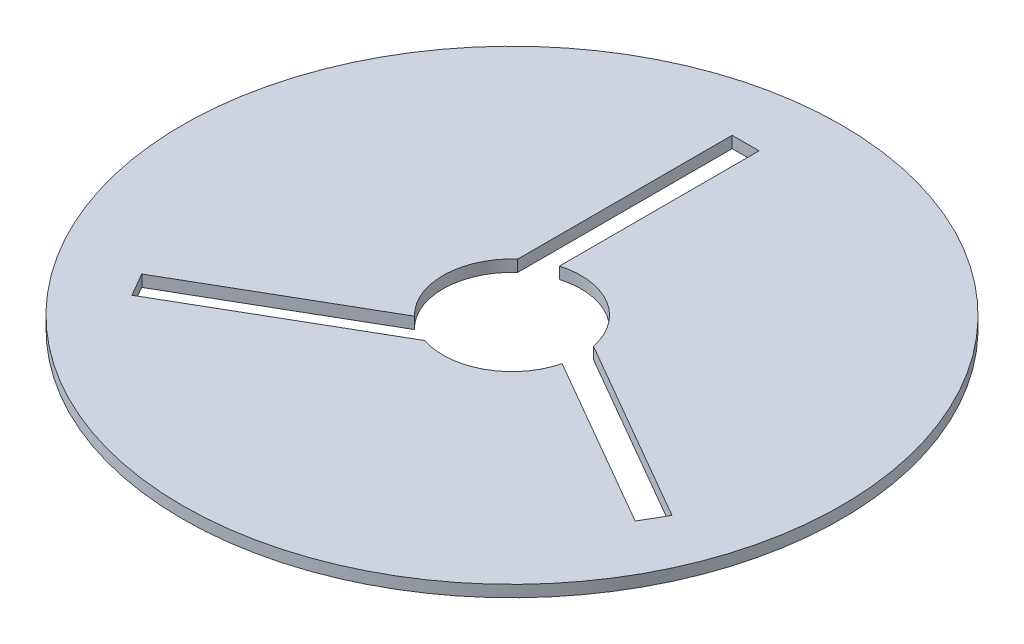
ISO-10303-21;
HEADER;
FILE_DESCRIPTION(('STEP AP214'),'2;1');
FILE_NAME('part.step','',(''),(''),'','','');
FILE_SCHEMA(('AUTOMOTIVE_DESIGN { 1 0 10303 214 1 1 1 1 }'));
ENDSEC;
DATA;
#1=APPLICATION_CONTEXT('core data for automotive mechanical design processes');
#2=APPLICATION_PROTOCOL_DEFINITION('international standard','automotive_design',2000,#1);
#3=PRODUCT_CONTEXT('',#1,'mechanical');
#4=PRODUCT('Part','Part','',(#3));
#5=PRODUCT_RELATED_PRODUCT_CATEGORY('part','',(#4));
#6=PRODUCT_DEFINITION_FORMATION('','',#4);
#7=PRODUCT_DEFINITION_CONTEXT('part definition',#1,'design');
#8=PRODUCT_DEFINITION('design','',#6,#7);
#9=PRODUCT_DEFINITION_SHAPE('','',#8);
#10=(LENGTH_UNIT() NAMED_UNIT(*) SI_UNIT(.MILLI.,.METRE.));
#11=(NAMED_UNIT(*) PLANE_ANGLE_UNIT() SI_UNIT($,.RADIAN.));
#12=(NAMED_UNIT(*) SI_UNIT($,.STERADIAN.) SOLID_ANGLE_UNIT());
#13=UNCERTAINTY_MEASURE_WITH_UNIT(LENGTH_MEASURE(1.E-05),#10,'distance_accuracy_value','');
#14=(GEOMETRIC_REPRESENTATION_CONTEXT(3) GLOBAL_UNCERTAINTY_ASSIGNED_CONTEXT((#13)) GLOBAL_UNIT_ASSIGNED_CONTEXT((#10,
#11,#12)) REPRESENTATION_CONTEXT('',''));
#15=CARTESIAN_POINT('',(0.,0.,0.));
#16=DIRECTION('',(0.,0.,1.));
#17=DIRECTION('',(1.,0.,0.));
#18=AXIS2_PLACEMENT_3D('',#15,#16,#17);
#19=CARTESIAN_POINT('',(0.,3.,0.));
#20=DIRECTION('',(0.,-1.,0.));
#21=DIRECTION('',(0.,0.,-1.));
#22=AXIS2_PLACEMENT_3D('',#19,#20,#21);
#23=CYLINDRICAL_SURFACE('',#22,17.8);
#24=CARTESIAN_POINT('',(0.,0.,0.));
#25=DIRECTION('',(0.,1.,0.));
#26=DIRECTION('',(0.,0.,1.));
#27=AXIS2_PLACEMENT_3D('',#24,#25,#26);
#28=CIRCLE('',#27,17.8);
#29=CARTESIAN_POINT('',(-5.61081880339964,0.,16.8925638183023));
#30=VERTEX_POINT('',#29);
#31=CARTESIAN_POINT('',(17.2630899328785,0.,4.33886228974228));
#32=VERTEX_POINT('',#31);
#33=EDGE_CURVE('E164',#30,#32,#28,.T.);
#34=ORIENTED_EDGE('',*,*,#33,.F.);
#35=DIRECTION('',(0.,-1.,0.));
#36=VECTOR('',#35,1.);
#37=CARTESIAN_POINT('',(-5.61081880339964,3.,16.8925638183023));
#38=LINE('',#37,#36);
#39=CARTESIAN_POINT('',(-5.61081880339964,3.,16.8925638183023));
#40=VERTEX_POINT('',#39);
#41=EDGE_CURVE('E11',#40,#30,#38,.T.);
#42=ORIENTED_EDGE('',*,*,#41,.F.);
#43=CARTESIAN_POINT('',(0.,3.,0.));
#44=DIRECTION('',(0.,1.,0.));
#45=DIRECTION('',(0.,0.,1.));
#46=AXIS2_PLACEMENT_3D('',#43,#44,#45);
#47=CIRCLE('',#46,17.8);
#48=CARTESIAN_POINT('',(17.2630899328785,3.,4.33886228974228));
#49=VERTEX_POINT('',#48);
#50=EDGE_CURVE('E199',#40,#49,#47,.T.);
#51=ORIENTED_EDGE('',*,*,#50,.T.);
#52=DIRECTION('',(0.,-1.,0.));
#53=VECTOR('',#52,1.);
#54=CARTESIAN_POINT('',(17.2630899328785,3.,4.33886228974228));
#55=LINE('',#54,#53);
#56=EDGE_CURVE('E59',#49,#32,#55,.T.);
#57=ORIENTED_EDGE('',*,*,#56,.T.);
#58=EDGE_LOOP('',(#34,#42,#51,#57));
#59=FACE_BOUND('',#58,.T.);
#60=ADVANCED_FACE('F43',(#59),#23,.F.);
#61=CARTESIAN_POINT('',(5.91198999999993,3.,10.239867053839));
#62=DIRECTION('',(-0.5,0.,-0.866025403784438));
#63=DIRECTION('',(-0.866025403784439,0.,0.5));
#64=AXIS2_PLACEMENT_3D('',#61,#62,#63);
#65=PLANE('',#64);
#66=DIRECTION('',(0.866025403784439,0.,-0.5));
#67=VECTOR('',#66,1.);
#68=CARTESIAN_POINT('',(5.91198999999993,0.,10.239867053839));
#69=LINE('',#68,#67);
#70=CARTESIAN_POINT('',(-53.4973526996125,0.,44.539867053839));
#71=VERTEX_POINT('',#70);
#72=EDGE_CURVE('E166',#71,#30,#69,.T.);
#73=ORIENTED_EDGE('',*,*,#72,.F.);
#74=DIRECTION('',(0.,-1.,0.));
#75=VECTOR('',#74,1.);
#76=CARTESIAN_POINT('',(-53.4973526996125,3.,44.539867053839));
#77=LINE('',#76,#75);
#78=CARTESIAN_POINT('',(-53.4973526996125,3.,44.539867053839));
#79=VERTEX_POINT('',#78);
#80=EDGE_CURVE('E51',#79,#71,#77,.T.);
#81=ORIENTED_EDGE('',*,*,#80,.F.);
#82=DIRECTION('',(0.866025403784439,0.,-0.5));
#83=VECTOR('',#82,1.);
#84=CARTESIAN_POINT('',(5.91198999999993,3.,10.239867053839));
#85=LINE('',#84,#83);
#86=EDGE_CURVE('E237',#79,#40,#85,.T.);
#87=ORIENTED_EDGE('',*,*,#86,.T.);
#88=ORIENTED_EDGE('',*,*,#41,.T.);
#89=EDGE_LOOP('',(#73,#81,#87,#88));
#90=FACE_BOUND('',#89,.T.);
#91=ADVANCED_FACE('F224',(#90),#65,.T.);
#92=CARTESIAN_POINT('',(-59.4093426996125,3.,34.3));
#93=DIRECTION('',(0.866025403784439,0.,-0.5));
#94=DIRECTION('',(-0.5,0.,-0.866025403784439));
#95=AXIS2_PLACEMENT_3D('',#92,#93,#94);
#96=PLANE('',#95);
#97=DIRECTION('',(0.5,0.,0.866025403784439));
#98=VECTOR('',#97,1.);
#99=CARTESIAN_POINT('',(-59.4093426996125,0.,34.3));
#100=LINE('',#99,#98);
#101=CARTESIAN_POINT('',(-56.9723526996125,0.,38.5209904975371));
#102=VERTEX_POINT('',#101);
#103=EDGE_CURVE('E169',#102,#71,#100,.T.);
#104=ORIENTED_EDGE('',*,*,#103,.F.);
#105=DIRECTION('',(0.,-1.,0.));
#106=VECTOR('',#105,1.);
#107=CARTESIAN_POINT('',(-56.9723526996125,3.,38.5209904975371));
#108=LINE('',#107,#106);
#109=CARTESIAN_POINT('',(-56.9723526996125,3.,38.5209904975371));
#110=VERTEX_POINT('',#109);
#111=EDGE_CURVE('E213',#110,#102,#108,.T.);
#112=ORIENTED_EDGE('',*,*,#111,.F.);
#113=DIRECTION('',(0.5,0.,0.866025403784439));
#114=VECTOR('',#113,1.);
#115=CARTESIAN_POINT('',(-59.4093426996125,3.,34.3));
#116=LINE('',#115,#114);
#117=EDGE_CURVE('E220',#110,#79,#116,.T.);
#118=ORIENTED_EDGE('',*,*,#117,.T.);
#119=ORIENTED_EDGE('',*,*,#80,.T.);
#120=EDGE_LOOP('',(#104,#112,#118,#119));
#121=FACE_BOUND('',#120,.T.);
#122=ADVANCED_FACE('F218',(#121),#96,.T.);
#123=CARTESIAN_POINT('',(2.43698999999993,3.,4.22099049753716));
#124=DIRECTION('',(0.5,0.,0.866025403784439));
#125=DIRECTION('',(0.866025403784439,0.,-0.5));
#126=AXIS2_PLACEMENT_3D('',#123,#124,#125);
#127=PLANE('',#126);
#128=DIRECTION('',(-0.866025403784439,0.,0.5));
#129=VECTOR('',#128,1.);
#130=CARTESIAN_POINT('',(2.43698999999993,0.,4.22099049753716));
#131=LINE('',#130,#129);
#132=CARTESIAN_POINT('',(-12.3891099328786,0.,12.7808432848169));
#133=VERTEX_POINT('',#132);
#134=EDGE_CURVE('E172',#133,#102,#131,.T.);
#135=ORIENTED_EDGE('',*,*,#134,.F.);
#136=DIRECTION('',(0.,-1.,0.));
#137=VECTOR('',#136,1.);
#138=CARTESIAN_POINT('',(-12.3891099328786,3.,12.7808432848169));
#139=LINE('',#138,#137);
#140=CARTESIAN_POINT('',(-12.3891099328786,3.,12.7808432848169));
#141=VERTEX_POINT('',#140);
#142=EDGE_CURVE('E211',#141,#133,#139,.T.);
#143=ORIENTED_EDGE('',*,*,#142,.F.);
#144=DIRECTION('',(-0.866025403784439,0.,0.5));
#145=VECTOR('',#144,1.);
#146=CARTESIAN_POINT('',(2.43698999999993,3.,4.22099049753716));
#147=LINE('',#146,#145);
#148=EDGE_CURVE('E234',#141,#110,#147,.T.);
#149=ORIENTED_EDGE('',*,*,#148,.T.);
#150=ORIENTED_EDGE('',*,*,#111,.T.);
#151=EDGE_LOOP('',(#135,#143,#149,#150));
#152=FACE_BOUND('',#151,.T.);
#153=ADVANCED_FACE('F231',(#152),#127,.T.);
#154=CARTESIAN_POINT('',(0.,3.,0.));
#155=DIRECTION('',(0.,-1.,0.));
#156=DIRECTION('',(0.,0.,-1.));
#157=AXIS2_PLACEMENT_3D('',#154,#155,#156);
#158=CYLINDRICAL_SURFACE('',#157,17.8);
#159=CARTESIAN_POINT('',(0.,0.,0.));
#160=DIRECTION('',(0.,1.,0.));
#161=DIRECTION('',(0.,0.,1.));
#162=AXIS2_PLACEMENT_3D('',#159,#160,#161);
#163=CIRCLE('',#162,17.8);
#164=CARTESIAN_POINT('',(-11.82398,0.,-13.3053935289265));
#165=VERTEX_POINT('',#164);
#166=EDGE_CURVE('E175',#165,#133,#163,.T.);
#167=ORIENTED_EDGE('',*,*,#166,.F.);
#168=DIRECTION('',(0.,-1.,0.));
#169=VECTOR('',#168,1.);
#170=CARTESIAN_POINT('',(-11.82398,3.,-13.3053935289265));
#171=LINE('',#170,#169);
#172=CARTESIAN_POINT('',(-11.82398,3.,-13.3053935289265));
#173=VERTEX_POINT('',#172);
#174=EDGE_CURVE('E209',#173,#165,#171,.T.);
#175=ORIENTED_EDGE('',*,*,#174,.F.);
#176=CARTESIAN_POINT('',(0.,3.,0.));
#177=DIRECTION('',(0.,1.,0.));
#178=DIRECTION('',(0.,0.,1.));
#179=AXIS2_PLACEMENT_3D('',#176,#177,#178);
#180=CIRCLE('',#179,17.8);
#181=EDGE_CURVE('E239',#173,#141,#180,.T.);
#182=ORIENTED_EDGE('',*,*,#181,.T.);
#183=ORIENTED_EDGE('',*,*,#142,.T.);
#184=EDGE_LOOP('',(#167,#175,#182,#183));
#185=FACE_BOUND('',#184,.T.);
#186=ADVANCED_FACE('F279',(#185),#158,.F.);
#187=CARTESIAN_POINT('',(-11.82398,3.,0.));
#188=DIRECTION('',(1.,0.,0.));
#189=DIRECTION('',(0.,0.,-1.));
#190=AXIS2_PLACEMENT_3D('',#187,#188,#189);
#191=PLANE('',#190);
#192=DIRECTION('',(0.,0.,1.));
#193=VECTOR('',#192,1.);
#194=CARTESIAN_POINT('',(-11.82398,0.,0.));
#195=LINE('',#194,#193);
#196=CARTESIAN_POINT('',(-11.82398,0.,-68.6000000000001));
#197=VERTEX_POINT('',#196);
#198=EDGE_CURVE('E178',#197,#165,#195,.T.);
#199=ORIENTED_EDGE('',*,*,#198,.F.);
#200=DIRECTION('',(0.,-1.,0.));
#201=VECTOR('',#200,1.);
#202=CARTESIAN_POINT('',(-11.82398,3.,-68.6000000000001));
#203=LINE('',#202,#201);
#204=CARTESIAN_POINT('',(-11.82398,3.,-68.6000000000001));
#205=VERTEX_POINT('',#204);
#206=EDGE_CURVE('E207',#205,#197,#203,.T.);
#207=ORIENTED_EDGE('',*,*,#206,.F.);
#208=DIRECTION('',(0.,0.,1.));
#209=VECTOR('',#208,1.);
#210=CARTESIAN_POINT('',(-11.82398,3.,0.));
#211=LINE('',#210,#209);
#212=EDGE_CURVE('E245',#205,#173,#211,.T.);
#213=ORIENTED_EDGE('',*,*,#212,.T.);
#214=ORIENTED_EDGE('',*,*,#174,.T.);
#215=EDGE_LOOP('',(#199,#207,#213,#214));
#216=FACE_BOUND('',#215,.T.);
#217=ADVANCED_FACE('F282',(#216),#191,.T.);
#218=CARTESIAN_POINT('',(0.,3.,-68.6000000000001));
#219=DIRECTION('',(0.,0.,1.));
#220=DIRECTION('',(1.,0.,0.));
#221=AXIS2_PLACEMENT_3D('',#218,#219,#220);
#222=PLANE('',#221);
#223=DIRECTION('',(-1.,0.,0.));
#224=VECTOR('',#223,1.);
#225=CARTESIAN_POINT('',(0.,0.,-68.6000000000001));
#226=LINE('',#225,#224);
#227=CARTESIAN_POINT('',(-4.87397999999999,0.,-68.6000000000001));
#228=VERTEX_POINT('',#227);
#229=EDGE_CURVE('E181',#228,#197,#226,.T.);
#230=ORIENTED_EDGE('',*,*,#229,.F.);
#231=DIRECTION('',(0.,-1.,0.));
#232=VECTOR('',#231,1.);
#233=CARTESIAN_POINT('',(-4.87397999999999,3.,-68.6000000000001));
#234=LINE('',#233,#232);
#235=CARTESIAN_POINT('',(-4.87397999999999,3.,-68.6000000000001));
#236=VERTEX_POINT('',#235);
#237=EDGE_CURVE('E205',#236,#228,#234,.T.);
#238=ORIENTED_EDGE('',*,*,#237,.F.);
#239=DIRECTION('',(-1.,0.,0.));
#240=VECTOR('',#239,1.);
#241=CARTESIAN_POINT('',(0.,3.,-68.6000000000001));
#242=LINE('',#241,#240);
#243=EDGE_CURVE('E248',#236,#205,#242,.T.);
#244=ORIENTED_EDGE('',*,*,#243,.T.);
#245=ORIENTED_EDGE('',*,*,#206,.T.);
#246=EDGE_LOOP('',(#230,#238,#244,#245));
#247=FACE_BOUND('',#246,.T.);
#248=ADVANCED_FACE('F286',(#247),#222,.T.);
#249=CARTESIAN_POINT('',(-4.87397999999999,3.,0.));
#250=DIRECTION('',(-1.,0.,0.));
#251=DIRECTION('',(0.,0.,1.));
#252=AXIS2_PLACEMENT_3D('',#249,#250,#251);
#253=PLANE('',#252);
#254=DIRECTION('',(0.,0.,-1.));
#255=VECTOR('',#254,1.);
#256=CARTESIAN_POINT('',(-4.87397999999999,0.,0.));
#257=LINE('',#256,#255);
#258=CARTESIAN_POINT('',(-4.87397999999999,0.,-17.1197055745594));
#259=VERTEX_POINT('',#258);
#260=EDGE_CURVE('E184',#259,#228,#257,.T.);
#261=ORIENTED_EDGE('',*,*,#260,.F.);
#262=DIRECTION('',(0.,-1.,0.));
#263=VECTOR('',#262,1.);
#264=CARTESIAN_POINT('',(-4.87397999999999,3.,-17.1197055745594));
#265=LINE('',#264,#263);
#266=CARTESIAN_POINT('',(-4.87397999999999,3.,-17.1197055745594));
#267=VERTEX_POINT('',#266);
#268=EDGE_CURVE('E203',#267,#259,#265,.T.);
#269=ORIENTED_EDGE('',*,*,#268,.F.);
#270=DIRECTION('',(0.,0.,-1.));
#271=VECTOR('',#270,1.);
#272=CARTESIAN_POINT('',(-4.87397999999999,3.,0.));
#273=LINE('',#272,#271);
#274=EDGE_CURVE('E251',#267,#236,#273,.T.);
#275=ORIENTED_EDGE('',*,*,#274,.T.);
#276=ORIENTED_EDGE('',*,*,#237,.T.);
#277=EDGE_LOOP('',(#261,#269,#275,#276));
#278=FACE_BOUND('',#277,.T.);
#279=ADVANCED_FACE('F290',(#278),#253,.T.);
#280=CARTESIAN_POINT('',(0.,3.,0.));
#281=DIRECTION('',(0.,-1.,0.));
#282=DIRECTION('',(0.,0.,-1.));
#283=AXIS2_PLACEMENT_3D('',#280,#281,#282);
#284=CYLINDRICAL_SURFACE('',#283,17.8);
#285=CARTESIAN_POINT('',(0.,0.,0.));
#286=DIRECTION('',(0.,1.,0.));
#287=DIRECTION('',(0.,0.,1.));
#288=AXIS2_PLACEMENT_3D('',#285,#286,#287);
#289=CIRCLE('',#288,17.8);
#290=CARTESIAN_POINT('',(17.4347988033994,0.,-3.58717028937607));
#291=VERTEX_POINT('',#290);
#292=EDGE_CURVE('E187',#291,#259,#289,.T.);
#293=ORIENTED_EDGE('',*,*,#292,.F.);
#294=DIRECTION('',(0.,-1.,0.));
#295=VECTOR('',#294,1.);
#296=CARTESIAN_POINT('',(17.4347988033994,3.,-3.58717028937607));
#297=LINE('',#296,#295);
#298=CARTESIAN_POINT('',(17.4347988033994,3.,-3.58717028937607));
#299=VERTEX_POINT('',#298);
#300=EDGE_CURVE('E142',#299,#291,#297,.T.);
#301=ORIENTED_EDGE('',*,*,#300,.F.);
#302=CARTESIAN_POINT('',(0.,3.,0.));
#303=DIRECTION('',(0.,1.,0.));
#304=DIRECTION('',(0.,0.,1.));
#305=AXIS2_PLACEMENT_3D('',#302,#303,#304);
#306=CIRCLE('',#305,17.8);
#307=EDGE_CURVE('E153',#299,#267,#306,.T.);
#308=ORIENTED_EDGE('',*,*,#307,.T.);
#309=ORIENTED_EDGE('',*,*,#268,.T.);
#310=EDGE_LOOP('',(#293,#301,#308,#309));
#311=FACE_BOUND('',#310,.T.);
#312=ADVANCED_FACE('F255',(#311),#284,.F.);
#313=CARTESIAN_POINT('',(5.91199000000008,3.,-10.2398670538393));
#314=DIRECTION('',(-0.5,0.,0.866025403784439));
#315=DIRECTION('',(0.866025403784439,0.,0.5));
#316=AXIS2_PLACEMENT_3D('',#313,#314,#315);
#317=PLANE('',#316);
#318=DIRECTION('',(-0.866025403784439,0.,-0.5));
#319=VECTOR('',#318,1.);
#320=CARTESIAN_POINT('',(5.91199000000008,0.,-10.2398670538393));
#321=LINE('',#320,#319);
#322=CARTESIAN_POINT('',(65.3213326996125,0.,24.0601329461607));
#323=VERTEX_POINT('',#322);
#324=EDGE_CURVE('E138',#323,#291,#321,.T.);
#325=ORIENTED_EDGE('',*,*,#324,.F.);
#326=DIRECTION('',(0.,-1.,0.));
#327=VECTOR('',#326,1.);
#328=CARTESIAN_POINT('',(65.3213326996125,3.,24.0601329461607));
#329=LINE('',#328,#327);
#330=CARTESIAN_POINT('',(65.3213326996125,3.,24.0601329461607));
#331=VERTEX_POINT('',#330);
#332=EDGE_CURVE('E133',#331,#323,#329,.T.);
#333=ORIENTED_EDGE('',*,*,#332,.F.);
#334=DIRECTION('',(-0.866025403784439,0.,-0.5));
#335=VECTOR('',#334,1.);
#336=CARTESIAN_POINT('',(5.91199000000008,3.,-10.2398670538393));
#337=LINE('',#336,#335);
#338=EDGE_CURVE('E136',#331,#299,#337,.T.);
#339=ORIENTED_EDGE('',*,*,#338,.T.);
#340=ORIENTED_EDGE('',*,*,#300,.T.);
#341=EDGE_LOOP('',(#325,#333,#339,#340));
#342=FACE_BOUND('',#341,.T.);
#343=ADVANCED_FACE('F135',(#342),#317,.T.);
#344=CARTESIAN_POINT('',(59.4093426996124,3.,34.3));
#345=DIRECTION('',(-0.866025403784438,0.,-0.5));
#346=DIRECTION('',(-0.5,0.,0.866025403784439));
#347=AXIS2_PLACEMENT_3D('',#344,#345,#346);
#348=PLANE('',#347);
#349=DIRECTION('',(0.5,0.,-0.866025403784439));
#350=VECTOR('',#349,1.);
#351=CARTESIAN_POINT('',(59.4093426996124,0.,34.3));
#352=LINE('',#351,#350);
#353=CARTESIAN_POINT('',(61.8463326996125,0.,30.0790095024626));
#354=VERTEX_POINT('',#353);
#355=EDGE_CURVE('E191',#354,#323,#352,.T.);
#356=ORIENTED_EDGE('',*,*,#355,.F.);
#357=DIRECTION('',(0.,-1.,0.));
#358=VECTOR('',#357,1.);
#359=CARTESIAN_POINT('',(61.8463326996125,3.,30.0790095024626));
#360=LINE('',#359,#358);
#361=CARTESIAN_POINT('',(61.8463326996125,3.,30.0790095024626));
#362=VERTEX_POINT('',#361);
#363=EDGE_CURVE('E96',#362,#354,#360,.T.);
#364=ORIENTED_EDGE('',*,*,#363,.F.);
#365=DIRECTION('',(0.5,0.,-0.866025403784439));
#366=VECTOR('',#365,1.);
#367=CARTESIAN_POINT('',(59.4093426996124,3.,34.3));
#368=LINE('',#367,#366);
#369=EDGE_CURVE('E150',#362,#331,#368,.T.);
#370=ORIENTED_EDGE('',*,*,#369,.T.);
#371=ORIENTED_EDGE('',*,*,#332,.T.);
#372=EDGE_LOOP('',(#356,#364,#370,#371));
#373=FACE_BOUND('',#372,.T.);
#374=ADVANCED_FACE('F155',(#373),#348,.T.);
#375=CARTESIAN_POINT('',(2.43699000000007,3.,-4.2209904975374));
#376=DIRECTION('',(0.5,0.,-0.866025403784439));
#377=DIRECTION('',(-0.866025403784439,0.,-0.5));
#378=AXIS2_PLACEMENT_3D('',#375,#376,#377);
#379=PLANE('',#378);
#380=DIRECTION('',(0.866025403784439,0.,0.5));
#381=VECTOR('',#380,1.);
#382=CARTESIAN_POINT('',(2.43699000000007,0.,-4.2209904975374));
#383=LINE('',#382,#381);
#384=EDGE_CURVE('E193',#32,#354,#383,.T.);
#385=ORIENTED_EDGE('',*,*,#384,.F.);
#386=ORIENTED_EDGE('',*,*,#56,.F.);
#387=DIRECTION('',(0.866025403784439,0.,0.5));
#388=VECTOR('',#387,1.);
#389=CARTESIAN_POINT('',(2.43699000000007,3.,-4.2209904975374));
#390=LINE('',#389,#388);
#391=EDGE_CURVE('E156',#49,#362,#390,.T.);
#392=ORIENTED_EDGE('',*,*,#391,.T.);
#393=ORIENTED_EDGE('',*,*,#363,.T.);
#394=EDGE_LOOP('',(#385,#386,#392,#393));
#395=FACE_BOUND('',#394,.T.);
#396=ADVANCED_FACE('F257',(#395),#379,.T.);
#397=CARTESIAN_POINT('',(0.,3.,0.));
#398=DIRECTION('',(0.,-1.,0.));
#399=DIRECTION('',(0.,0.,-1.));
#400=AXIS2_PLACEMENT_3D('',#397,#398,#399);
#401=CYLINDRICAL_SURFACE('',#400,85.);
#402=CARTESIAN_POINT('',(0.,3.,0.));
#403=DIRECTION('',(0.,1.,0.));
#404=DIRECTION('',(0.,0.,1.));
#405=AXIS2_PLACEMENT_3D('',#402,#403,#404);
#406=CIRCLE('',#405,85.);
#407=CARTESIAN_POINT('',(0.,3.,85.));
#408=VERTEX_POINT('',#407);
#409=EDGE_CURVE('E158',#408,#408,#406,.T.);
#410=ORIENTED_EDGE('',*,*,#409,.F.);
#411=EDGE_LOOP('',(#410));
#412=FACE_BOUND('',#411,.T.);
#413=CARTESIAN_POINT('',(0.,0.,0.));
#414=DIRECTION('',(0.,1.,0.));
#415=DIRECTION('',(0.,0.,1.));
#416=AXIS2_PLACEMENT_3D('',#413,#414,#415);
#417=CIRCLE('',#416,85.);
#418=CARTESIAN_POINT('',(0.,0.,85.));
#419=VERTEX_POINT('',#418);
#420=EDGE_CURVE('E196',#419,#419,#417,.T.);
#421=ORIENTED_EDGE('',*,*,#420,.T.);
#422=EDGE_LOOP('',(#421));
#423=FACE_BOUND('',#422,.T.);
#424=ADVANCED_FACE('F259',(#412,#423),#401,.T.);
#425=CARTESIAN_POINT('',(0.,3.,0.));
#426=DIRECTION('',(0.,1.,0.));
#427=DIRECTION('',(0.,0.,1.));
#428=AXIS2_PLACEMENT_3D('',#425,#426,#427);
#429=PLANE('',#428);
#430=ORIENTED_EDGE('',*,*,#50,.F.);
#431=ORIENTED_EDGE('',*,*,#86,.F.);
#432=ORIENTED_EDGE('',*,*,#117,.F.);
#433=ORIENTED_EDGE('',*,*,#148,.F.);
#434=ORIENTED_EDGE('',*,*,#181,.F.);
#435=ORIENTED_EDGE('',*,*,#212,.F.);
#436=ORIENTED_EDGE('',*,*,#243,.F.);
#437=ORIENTED_EDGE('',*,*,#274,.F.);
#438=ORIENTED_EDGE('',*,*,#307,.F.);
#439=ORIENTED_EDGE('',*,*,#338,.F.);
#440=ORIENTED_EDGE('',*,*,#369,.F.);
#441=ORIENTED_EDGE('',*,*,#391,.F.);
#442=EDGE_LOOP('',(#430,#431,#432,#433,#434,#435,#436,#437,#438,#439,#440,#441));
#443=FACE_BOUND('',#442,.T.);
#444=ORIENTED_EDGE('',*,*,#409,.T.);
#445=EDGE_LOOP('',(#444));
#446=FACE_BOUND('',#445,.T.);
#447=ADVANCED_FACE('F147',(#443,#446),#429,.T.);
#448=CARTESIAN_POINT('',(0.,0.,0.));
#449=DIRECTION('',(0.,1.,0.));
#450=DIRECTION('',(0.,0.,1.));
#451=AXIS2_PLACEMENT_3D('',#448,#449,#450);
#452=PLANE('',#451);
#453=ORIENTED_EDGE('',*,*,#33,.T.);
#454=ORIENTED_EDGE('',*,*,#384,.T.);
#455=ORIENTED_EDGE('',*,*,#355,.T.);
#456=ORIENTED_EDGE('',*,*,#324,.T.);
#457=ORIENTED_EDGE('',*,*,#292,.T.);
#458=ORIENTED_EDGE('',*,*,#260,.T.);
#459=ORIENTED_EDGE('',*,*,#229,.T.);
#460=ORIENTED_EDGE('',*,*,#198,.T.);
#461=ORIENTED_EDGE('',*,*,#166,.T.);
#462=ORIENTED_EDGE('',*,*,#134,.T.);
#463=ORIENTED_EDGE('',*,*,#103,.T.);
#464=ORIENTED_EDGE('',*,*,#72,.T.);
#465=EDGE_LOOP('',(#453,#454,#455,#456,#457,#458,#459,#460,#461,#462,#463,#464));
#466=FACE_BOUND('',#465,.T.);
#467=ORIENTED_EDGE('',*,*,#420,.F.);
#468=EDGE_LOOP('',(#467));
#469=FACE_BOUND('',#468,.T.);
#470=ADVANCED_FACE('F226',(#466,#469),#452,.F.);
#471=CLOSED_SHELL('',(#60,#91,#122,#153,#186,#217,#248,#279,#312,#343,#374,#396,#424,#447,#470));
#472=MANIFOLD_SOLID_BREP('B2',#471);
#473=ADVANCED_BREP_SHAPE_REPRESENTATION('',(#18,#472),#14);
#474=SHAPE_DEFINITION_REPRESENTATION(#9,#473);
ENDSEC;
END-ISO-10303-21;
